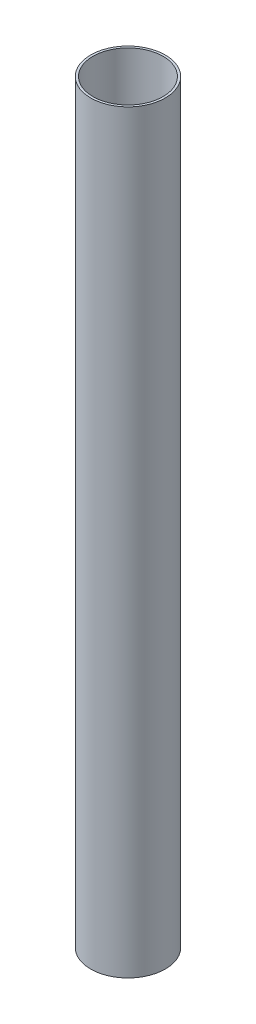
ISO-10303-21;
HEADER;
FILE_DESCRIPTION(('STEP AP214'),'2;1');
FILE_NAME('part.step','',(''),(''),'','','');
FILE_SCHEMA(('AUTOMOTIVE_DESIGN { 1 0 10303 214 1 1 1 1 }'));
ENDSEC;
DATA;
#1=APPLICATION_CONTEXT('core data for automotive mechanical design processes');
#2=APPLICATION_PROTOCOL_DEFINITION('international standard','automotive_design',2000,#1);
#3=PRODUCT_CONTEXT('',#1,'mechanical');
#4=PRODUCT('Part','Part','',(#3));
#5=PRODUCT_RELATED_PRODUCT_CATEGORY('part','',(#4));
#6=PRODUCT_DEFINITION_FORMATION('','',#4);
#7=PRODUCT_DEFINITION_CONTEXT('part definition',#1,'design');
#8=PRODUCT_DEFINITION('design','',#6,#7);
#9=PRODUCT_DEFINITION_SHAPE('','',#8);
#10=(LENGTH_UNIT() NAMED_UNIT(*) SI_UNIT(.MILLI.,.METRE.));
#11=(NAMED_UNIT(*) PLANE_ANGLE_UNIT() SI_UNIT($,.RADIAN.));
#12=(NAMED_UNIT(*) SI_UNIT($,.STERADIAN.) SOLID_ANGLE_UNIT());
#13=UNCERTAINTY_MEASURE_WITH_UNIT(LENGTH_MEASURE(1.E-05),#10,'distance_accuracy_value','');
#14=(GEOMETRIC_REPRESENTATION_CONTEXT(3) GLOBAL_UNCERTAINTY_ASSIGNED_CONTEXT((#13)) GLOBAL_UNIT_ASSIGNED_CONTEXT((#10,
#11,#12)) REPRESENTATION_CONTEXT('',''));
#15=CARTESIAN_POINT('',(0.,0.,0.));
#16=DIRECTION('',(0.,0.,1.));
#17=DIRECTION('',(1.,0.,0.));
#18=AXIS2_PLACEMENT_3D('',#15,#16,#17);
#19=CARTESIAN_POINT('',(0.,546.1,0.));
#20=DIRECTION('',(0.,1.,0.));
#21=DIRECTION('',(0.,0.,1.));
#22=AXIS2_PLACEMENT_3D('',#19,#20,#21);
#23=PLANE('',#22);
#24=CARTESIAN_POINT('',(0.,546.1,0.));
#25=DIRECTION('',(0.,1.,0.));
#26=DIRECTION('',(0.,0.,1.));
#27=AXIS2_PLACEMENT_3D('',#24,#25,#26);
#28=CIRCLE('',#27,27.);
#29=CARTESIAN_POINT('',(0.,546.1,27.));
#30=VERTEX_POINT('',#29);
#31=EDGE_CURVE('E10',#30,#30,#28,.T.);
#32=ORIENTED_EDGE('',*,*,#31,.T.);
#33=EDGE_LOOP('',(#32));
#34=FACE_BOUND('',#33,.T.);
#35=CARTESIAN_POINT('',(0.,546.1,0.));
#36=DIRECTION('',(0.,1.,0.));
#37=DIRECTION('',(0.,0.,1.));
#38=AXIS2_PLACEMENT_3D('',#35,#36,#37);
#39=CIRCLE('',#38,25.35);
#40=CARTESIAN_POINT('',(0.,546.1,25.35));
#41=VERTEX_POINT('',#40);
#42=EDGE_CURVE('E45',#41,#41,#39,.T.);
#43=ORIENTED_EDGE('',*,*,#42,.F.);
#44=EDGE_LOOP('',(#43));
#45=FACE_BOUND('',#44,.T.);
#46=ADVANCED_FACE('F34',(#34,#45),#23,.T.);
#47=CARTESIAN_POINT('',(0.,0.,0.));
#48=DIRECTION('',(0.,1.,0.));
#49=DIRECTION('',(0.,0.,1.));
#50=AXIS2_PLACEMENT_3D('',#47,#48,#49);
#51=PLANE('',#50);
#52=CARTESIAN_POINT('',(0.,0.,0.));
#53=DIRECTION('',(0.,1.,0.));
#54=DIRECTION('',(0.,0.,1.));
#55=AXIS2_PLACEMENT_3D('',#52,#53,#54);
#56=CIRCLE('',#55,27.);
#57=CARTESIAN_POINT('',(0.,0.,27.));
#58=VERTEX_POINT('',#57);
#59=EDGE_CURVE('E38',#58,#58,#56,.T.);
#60=ORIENTED_EDGE('',*,*,#59,.F.);
#61=EDGE_LOOP('',(#60));
#62=FACE_BOUND('',#61,.T.);
#63=CARTESIAN_POINT('',(0.,0.,0.));
#64=DIRECTION('',(0.,1.,0.));
#65=DIRECTION('',(0.,0.,1.));
#66=AXIS2_PLACEMENT_3D('',#63,#64,#65);
#67=CIRCLE('',#66,25.35);
#68=CARTESIAN_POINT('',(0.,0.,25.35));
#69=VERTEX_POINT('',#68);
#70=EDGE_CURVE('E47',#69,#69,#67,.T.);
#71=ORIENTED_EDGE('',*,*,#70,.T.);
#72=EDGE_LOOP('',(#71));
#73=FACE_BOUND('',#72,.T.);
#74=ADVANCED_FACE('F57',(#62,#73),#51,.F.);
#75=CARTESIAN_POINT('',(0.,546.1,0.));
#76=DIRECTION('',(0.,-1.,0.));
#77=DIRECTION('',(0.,0.,-1.));
#78=AXIS2_PLACEMENT_3D('',#75,#76,#77);
#79=CYLINDRICAL_SURFACE('',#78,27.);
#80=ORIENTED_EDGE('',*,*,#31,.F.);
#81=EDGE_LOOP('',(#80));
#82=FACE_BOUND('',#81,.T.);
#83=ORIENTED_EDGE('',*,*,#59,.T.);
#84=EDGE_LOOP('',(#83));
#85=FACE_BOUND('',#84,.T.);
#86=ADVANCED_FACE('F36',(#82,#85),#79,.T.);
#87=CARTESIAN_POINT('',(0.,546.1,0.));
#88=DIRECTION('',(0.,-1.,0.));
#89=DIRECTION('',(0.,0.,-1.));
#90=AXIS2_PLACEMENT_3D('',#87,#88,#89);
#91=CYLINDRICAL_SURFACE('',#90,25.35);
#92=ORIENTED_EDGE('',*,*,#42,.T.);
#93=EDGE_LOOP('',(#92));
#94=FACE_BOUND('',#93,.T.);
#95=ORIENTED_EDGE('',*,*,#70,.F.);
#96=EDGE_LOOP('',(#95));
#97=FACE_BOUND('',#96,.T.);
#98=ADVANCED_FACE('F53',(#94,#97),#91,.F.);
#99=CLOSED_SHELL('',(#46,#74,#86,#98));
#100=MANIFOLD_SOLID_BREP('B2',#99);
#101=ADVANCED_BREP_SHAPE_REPRESENTATION('',(#18,#100),#14);
#102=SHAPE_DEFINITION_REPRESENTATION(#9,#101);
ENDSEC;
END-ISO-10303-21;
